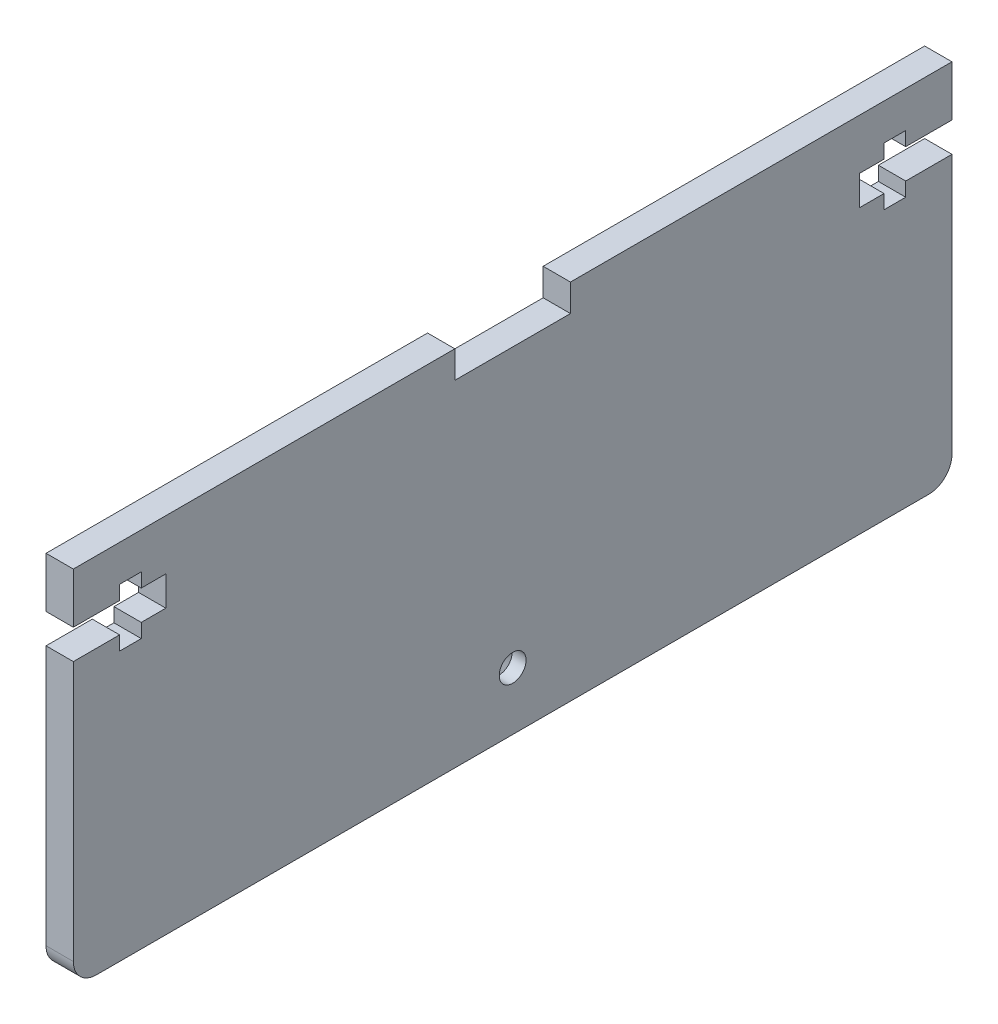
ISO-10303-21;
HEADER;
FILE_DESCRIPTION(('STEP AP214'),'2;1');
FILE_NAME('part.step','',(''),(''),'','','');
FILE_SCHEMA(('AUTOMOTIVE_DESIGN { 1 0 10303 214 1 1 1 1 }'));
ENDSEC;
DATA;
#1=APPLICATION_CONTEXT('core data for automotive mechanical design processes');
#2=APPLICATION_PROTOCOL_DEFINITION('international standard','automotive_design',2000,#1);
#3=PRODUCT_CONTEXT('',#1,'mechanical');
#4=PRODUCT('Part','Part','',(#3));
#5=PRODUCT_RELATED_PRODUCT_CATEGORY('part','',(#4));
#6=PRODUCT_DEFINITION_FORMATION('','',#4);
#7=PRODUCT_DEFINITION_CONTEXT('part definition',#1,'design');
#8=PRODUCT_DEFINITION('design','',#6,#7);
#9=PRODUCT_DEFINITION_SHAPE('','',#8);
#10=(LENGTH_UNIT() NAMED_UNIT(*) SI_UNIT(.MILLI.,.METRE.));
#11=(NAMED_UNIT(*) PLANE_ANGLE_UNIT() SI_UNIT($,.RADIAN.));
#12=(NAMED_UNIT(*) SI_UNIT($,.STERADIAN.) SOLID_ANGLE_UNIT());
#13=UNCERTAINTY_MEASURE_WITH_UNIT(LENGTH_MEASURE(1.E-05),#10,'distance_accuracy_value','');
#14=(GEOMETRIC_REPRESENTATION_CONTEXT(3) GLOBAL_UNCERTAINTY_ASSIGNED_CONTEXT((#13)) GLOBAL_UNIT_ASSIGNED_CONTEXT((#10,
#11,#12)) REPRESENTATION_CONTEXT('',''));
#15=CARTESIAN_POINT('',(0.,0.,0.));
#16=DIRECTION('',(0.,0.,1.));
#17=DIRECTION('',(1.,0.,0.));
#18=AXIS2_PLACEMENT_3D('',#15,#16,#17);
#19=CARTESIAN_POINT('',(3.,39.878,0.));
#20=DIRECTION('',(0.,-1.,0.));
#21=DIRECTION('',(0.,0.,-1.));
#22=AXIS2_PLACEMENT_3D('',#19,#20,#21);
#23=PLANE('',#22);
#24=DIRECTION('',(0.,0.,1.));
#25=VECTOR('',#24,1.);
#26=CARTESIAN_POINT('',(3.,39.878,0.));
#27=LINE('',#26,#25);
#28=CARTESIAN_POINT('',(3.,39.878,-41.91));
#29=VERTEX_POINT('',#28);
#30=CARTESIAN_POINT('',(3.,39.878,0.));
#31=VERTEX_POINT('',#30);
#32=EDGE_CURVE('E489',#29,#31,#27,.T.);
#33=ORIENTED_EDGE('',*,*,#32,.F.);
#34=DIRECTION('',(1.,0.,0.));
#35=VECTOR('',#34,1.);
#36=CARTESIAN_POINT('',(0.,39.878,-41.91));
#37=LINE('',#36,#35);
#38=CARTESIAN_POINT('',(0.,39.878,-41.91));
#39=VERTEX_POINT('',#38);
#40=EDGE_CURVE('E285',#39,#29,#37,.T.);
#41=ORIENTED_EDGE('',*,*,#40,.F.);
#42=DIRECTION('',(0.,0.,1.));
#43=VECTOR('',#42,1.);
#44=CARTESIAN_POINT('',(0.,39.878,0.));
#45=LINE('',#44,#43);
#46=CARTESIAN_POINT('',(0.,39.878,0.));
#47=VERTEX_POINT('',#46);
#48=EDGE_CURVE('E276',#39,#47,#45,.T.);
#49=ORIENTED_EDGE('',*,*,#48,.T.);
#50=DIRECTION('',(-1.,0.,0.));
#51=VECTOR('',#50,1.);
#52=CARTESIAN_POINT('',(3.,39.878,0.));
#53=LINE('',#52,#51);
#54=EDGE_CURVE('E493',#31,#47,#53,.T.);
#55=ORIENTED_EDGE('',*,*,#54,.F.);
#56=EDGE_LOOP('',(#33,#41,#49,#55));
#57=FACE_BOUND('',#56,.T.);
#58=ADVANCED_FACE('F32',(#57),#23,.F.);
#59=CARTESIAN_POINT('',(3.,0.,-96.52));
#60=DIRECTION('',(0.,0.,1.));
#61=DIRECTION('',(1.,0.,0.));
#62=AXIS2_PLACEMENT_3D('',#59,#60,#61);
#63=PLANE('',#62);
#64=DIRECTION('',(0.,1.,0.));
#65=VECTOR('',#64,1.);
#66=CARTESIAN_POINT('',(3.,0.,-96.52));
#67=LINE('',#66,#65);
#68=CARTESIAN_POINT('',(3.,2.54,-96.52));
#69=VERTEX_POINT('',#68);
#70=CARTESIAN_POINT('',(3.,31.0741,-96.52));
#71=VERTEX_POINT('',#70);
#72=EDGE_CURVE('E487',#69,#71,#67,.T.);
#73=ORIENTED_EDGE('',*,*,#72,.F.);
#74=DIRECTION('',(-1.,0.,0.));
#75=VECTOR('',#74,1.);
#76=CARTESIAN_POINT('',(3.,2.54,-96.52));
#77=LINE('',#76,#75);
#78=CARTESIAN_POINT('',(0.,2.54,-96.52));
#79=VERTEX_POINT('',#78);
#80=EDGE_CURVE('E511',#69,#79,#77,.T.);
#81=ORIENTED_EDGE('',*,*,#80,.T.);
#82=DIRECTION('',(0.,1.,0.));
#83=VECTOR('',#82,1.);
#84=CARTESIAN_POINT('',(0.,0.,-96.52));
#85=LINE('',#84,#83);
#86=CARTESIAN_POINT('',(0.,31.0741,-96.52));
#87=VERTEX_POINT('',#86);
#88=EDGE_CURVE('E501',#79,#87,#85,.T.);
#89=ORIENTED_EDGE('',*,*,#88,.T.);
#90=DIRECTION('',(1.,0.,0.));
#91=VECTOR('',#90,1.);
#92=CARTESIAN_POINT('',(0.,31.0741,-96.52));
#93=LINE('',#92,#91);
#94=EDGE_CURVE('E326',#87,#71,#93,.T.);
#95=ORIENTED_EDGE('',*,*,#94,.T.);
#96=EDGE_LOOP('',(#73,#81,#89,#95));
#97=FACE_BOUND('',#96,.T.);
#98=ADVANCED_FACE('F534',(#97),#63,.F.);
#99=CARTESIAN_POINT('',(3.,0.,0.));
#100=DIRECTION('',(0.,0.,-1.));
#101=DIRECTION('',(-1.,0.,0.));
#102=AXIS2_PLACEMENT_3D('',#99,#100,#101);
#103=PLANE('',#102);
#104=DIRECTION('',(0.,-1.,0.));
#105=VECTOR('',#104,1.);
#106=CARTESIAN_POINT('',(0.,0.,0.));
#107=LINE('',#106,#105);
#108=CARTESIAN_POINT('',(0.,34.338,0.));
#109=VERTEX_POINT('',#108);
#110=EDGE_CURVE('E494',#47,#109,#107,.T.);
#111=ORIENTED_EDGE('',*,*,#110,.T.);
#112=DIRECTION('',(1.,0.,0.));
#113=VECTOR('',#112,1.);
#114=CARTESIAN_POINT('',(0.,34.338,0.));
#115=LINE('',#114,#113);
#116=CARTESIAN_POINT('',(3.,34.338,0.));
#117=VERTEX_POINT('',#116);
#118=EDGE_CURVE('E448',#109,#117,#115,.T.);
#119=ORIENTED_EDGE('',*,*,#118,.T.);
#120=DIRECTION('',(0.,-1.,0.));
#121=VECTOR('',#120,1.);
#122=CARTESIAN_POINT('',(3.,0.,0.));
#123=LINE('',#122,#121);
#124=EDGE_CURVE('E479',#31,#117,#123,.T.);
#125=ORIENTED_EDGE('',*,*,#124,.F.);
#126=ORIENTED_EDGE('',*,*,#54,.T.);
#127=EDGE_LOOP('',(#111,#119,#125,#126));
#128=FACE_BOUND('',#127,.T.);
#129=ADVANCED_FACE('F591',(#128),#103,.F.);
#130=CARTESIAN_POINT('',(0.,31.0741,0.));
#131=VERTEX_POINT('',#130);
#132=CARTESIAN_POINT('',(0.,2.54,0.));
#133=VERTEX_POINT('',#132);
#134=EDGE_CURVE('E478',#131,#133,#107,.T.);
#135=ORIENTED_EDGE('',*,*,#134,.T.);
#136=DIRECTION('',(-1.,0.,0.));
#137=VECTOR('',#136,1.);
#138=CARTESIAN_POINT('',(3.,2.54,0.));
#139=LINE('',#138,#137);
#140=CARTESIAN_POINT('',(3.,2.54,0.));
#141=VERTEX_POINT('',#140);
#142=EDGE_CURVE('E11',#133,#141,#139,.F.);
#143=ORIENTED_EDGE('',*,*,#142,.T.);
#144=CARTESIAN_POINT('',(3.,31.0741,0.));
#145=VERTEX_POINT('',#144);
#146=EDGE_CURVE('E483',#145,#141,#123,.T.);
#147=ORIENTED_EDGE('',*,*,#146,.F.);
#148=DIRECTION('',(1.,0.,0.));
#149=VECTOR('',#148,1.);
#150=CARTESIAN_POINT('',(0.,31.0741,0.));
#151=LINE('',#150,#149);
#152=EDGE_CURVE('E417',#131,#145,#151,.T.);
#153=ORIENTED_EDGE('',*,*,#152,.F.);
#154=EDGE_LOOP('',(#135,#143,#147,#153));
#155=FACE_BOUND('',#154,.T.);
#156=ADVANCED_FACE('F546',(#155),#103,.F.);
#157=CARTESIAN_POINT('',(3.,0.,0.));
#158=DIRECTION('',(0.,1.,0.));
#159=DIRECTION('',(0.,0.,1.));
#160=AXIS2_PLACEMENT_3D('',#157,#158,#159);
#161=PLANE('',#160);
#162=DIRECTION('',(0.,0.,-1.));
#163=VECTOR('',#162,1.);
#164=CARTESIAN_POINT('',(0.,0.,0.));
#165=LINE('',#164,#163);
#166=CARTESIAN_POINT('',(0.,0.,-2.54));
#167=VERTEX_POINT('',#166);
#168=CARTESIAN_POINT('',(0.,0.,-93.98));
#169=VERTEX_POINT('',#168);
#170=EDGE_CURVE('E497',#167,#169,#165,.T.);
#171=ORIENTED_EDGE('',*,*,#170,.T.);
#172=DIRECTION('',(-1.,0.,0.));
#173=VECTOR('',#172,1.);
#174=CARTESIAN_POINT('',(3.,0.,-93.98));
#175=LINE('',#174,#173);
#176=CARTESIAN_POINT('',(3.,0.,-93.98));
#177=VERTEX_POINT('',#176);
#178=EDGE_CURVE('E521',#169,#177,#175,.F.);
#179=ORIENTED_EDGE('',*,*,#178,.T.);
#180=DIRECTION('',(0.,0.,-1.));
#181=VECTOR('',#180,1.);
#182=CARTESIAN_POINT('',(3.,0.,0.));
#183=LINE('',#182,#181);
#184=CARTESIAN_POINT('',(3.,0.,-2.54));
#185=VERTEX_POINT('',#184);
#186=EDGE_CURVE('E482',#185,#177,#183,.T.);
#187=ORIENTED_EDGE('',*,*,#186,.F.);
#188=DIRECTION('',(-1.,0.,0.));
#189=VECTOR('',#188,1.);
#190=CARTESIAN_POINT('',(3.,0.,-2.54));
#191=LINE('',#190,#189);
#192=EDGE_CURVE('E518',#185,#167,#191,.T.);
#193=ORIENTED_EDGE('',*,*,#192,.T.);
#194=EDGE_LOOP('',(#171,#179,#187,#193));
#195=FACE_BOUND('',#194,.T.);
#196=ADVANCED_FACE('F540',(#195),#161,.F.);
#197=CARTESIAN_POINT('',(3.,34.338,-96.52));
#198=VERTEX_POINT('',#197);
#199=CARTESIAN_POINT('',(3.,39.878,-96.52));
#200=VERTEX_POINT('',#199);
#201=EDGE_CURVE('E486',#198,#200,#67,.T.);
#202=ORIENTED_EDGE('',*,*,#201,.F.);
#203=DIRECTION('',(1.,0.,0.));
#204=VECTOR('',#203,1.);
#205=CARTESIAN_POINT('',(0.,34.338,-96.52));
#206=LINE('',#205,#204);
#207=CARTESIAN_POINT('',(0.,34.338,-96.52));
#208=VERTEX_POINT('',#207);
#209=EDGE_CURVE('E379',#208,#198,#206,.T.);
#210=ORIENTED_EDGE('',*,*,#209,.F.);
#211=CARTESIAN_POINT('',(0.,39.878,-96.52));
#212=VERTEX_POINT('',#211);
#213=EDGE_CURVE('E500',#208,#212,#85,.T.);
#214=ORIENTED_EDGE('',*,*,#213,.T.);
#215=DIRECTION('',(-1.,0.,0.));
#216=VECTOR('',#215,1.);
#217=CARTESIAN_POINT('',(3.,39.878,-96.52));
#218=LINE('',#217,#216);
#219=EDGE_CURVE('E508',#200,#212,#218,.T.);
#220=ORIENTED_EDGE('',*,*,#219,.F.);
#221=EDGE_LOOP('',(#202,#210,#214,#220));
#222=FACE_BOUND('',#221,.T.);
#223=ADVANCED_FACE('F607',(#222),#63,.F.);
#224=CARTESIAN_POINT('',(0.,39.878,-54.61));
#225=VERTEX_POINT('',#224);
#226=EDGE_CURVE('E503',#212,#225,#45,.T.);
#227=ORIENTED_EDGE('',*,*,#226,.T.);
#228=DIRECTION('',(1.,0.,0.));
#229=VECTOR('',#228,1.);
#230=CARTESIAN_POINT('',(0.,39.878,-54.61));
#231=LINE('',#230,#229);
#232=CARTESIAN_POINT('',(3.,39.878,-54.61));
#233=VERTEX_POINT('',#232);
#234=EDGE_CURVE('E288',#225,#233,#231,.T.);
#235=ORIENTED_EDGE('',*,*,#234,.T.);
#236=EDGE_CURVE('E490',#200,#233,#27,.T.);
#237=ORIENTED_EDGE('',*,*,#236,.F.);
#238=ORIENTED_EDGE('',*,*,#219,.T.);
#239=EDGE_LOOP('',(#227,#235,#237,#238));
#240=FACE_BOUND('',#239,.T.);
#241=ADVANCED_FACE('F600',(#240),#23,.F.);
#242=CARTESIAN_POINT('',(3.,0.,0.));
#243=DIRECTION('',(-1.,0.,0.));
#244=DIRECTION('',(0.,0.,1.));
#245=AXIS2_PLACEMENT_3D('',#242,#243,#244);
#246=PLANE('',#245);
#247=CARTESIAN_POINT('',(3.,6.35,-48.26));
#248=DIRECTION('',(1.,0.,0.));
#249=DIRECTION('',(0.,0.,-1.));
#250=AXIS2_PLACEMENT_3D('',#247,#248,#249);
#251=CIRCLE('',#250,1.47319999999999);
#252=CARTESIAN_POINT('',(3.,6.35,-49.7332));
#253=VERTEX_POINT('',#252);
#254=EDGE_CURVE('E451',#253,#253,#251,.T.);
#255=ORIENTED_EDGE('',*,*,#254,.F.);
#256=EDGE_LOOP('',(#255));
#257=FACE_BOUND('',#256,.T.);
#258=DIRECTION('',(0.,0.,-1.));
#259=VECTOR('',#258,1.);
#260=CARTESIAN_POINT('',(3.,36.878,-41.91));
#261=LINE('',#260,#259);
#262=CARTESIAN_POINT('',(3.,36.878,-41.91));
#263=VERTEX_POINT('',#262);
#264=CARTESIAN_POINT('',(3.,36.878,-54.61));
#265=VERTEX_POINT('',#264);
#266=EDGE_CURVE('E279',#263,#265,#261,.T.);
#267=ORIENTED_EDGE('',*,*,#266,.F.);
#268=DIRECTION('',(0.,-1.,0.));
#269=VECTOR('',#268,1.);
#270=CARTESIAN_POINT('',(3.,39.878,-41.91));
#271=LINE('',#270,#269);
#272=EDGE_CURVE('E262',#29,#263,#271,.T.);
#273=ORIENTED_EDGE('',*,*,#272,.F.);
#274=ORIENTED_EDGE('',*,*,#32,.T.);
#275=ORIENTED_EDGE('',*,*,#124,.T.);
#276=DIRECTION('',(0.,0.,1.));
#277=VECTOR('',#276,1.);
#278=CARTESIAN_POINT('',(3.,34.338,0.));
#279=LINE('',#278,#277);
#280=CARTESIAN_POINT('',(3.,34.338,-5.08));
#281=VERTEX_POINT('',#280);
#282=EDGE_CURVE('E387',#281,#117,#279,.T.);
#283=ORIENTED_EDGE('',*,*,#282,.F.);
#284=DIRECTION('',(0.,-1.,0.));
#285=VECTOR('',#284,1.);
#286=CARTESIAN_POINT('',(3.,34.338,-5.08));
#287=LINE('',#286,#285);
#288=CARTESIAN_POINT('',(3.,35.88105,-5.08));
#289=VERTEX_POINT('',#288);
#290=EDGE_CURVE('E444',#289,#281,#287,.T.);
#291=ORIENTED_EDGE('',*,*,#290,.F.);
#292=DIRECTION('',(0.,0.,1.));
#293=VECTOR('',#292,1.);
#294=CARTESIAN_POINT('',(3.,35.88105,-5.08));
#295=LINE('',#294,#293);
#296=CARTESIAN_POINT('',(3.,35.88105,-7.46125));
#297=VERTEX_POINT('',#296);
#298=EDGE_CURVE('E441',#297,#289,#295,.T.);
#299=ORIENTED_EDGE('',*,*,#298,.F.);
#300=DIRECTION('',(0.,1.,0.));
#301=VECTOR('',#300,1.);
#302=CARTESIAN_POINT('',(3.,35.88105,-7.46125));
#303=LINE('',#302,#301);
#304=CARTESIAN_POINT('',(3.,34.338,-7.46125));
#305=VERTEX_POINT('',#304);
#306=EDGE_CURVE('E438',#305,#297,#303,.T.);
#307=ORIENTED_EDGE('',*,*,#306,.F.);
#308=DIRECTION('',(0.,0.,1.));
#309=VECTOR('',#308,1.);
#310=CARTESIAN_POINT('',(3.,34.338,-7.46125));
#311=LINE('',#310,#309);
#312=CARTESIAN_POINT('',(3.,34.338,-10.16));
#313=VERTEX_POINT('',#312);
#314=EDGE_CURVE('E435',#313,#305,#311,.T.);
#315=ORIENTED_EDGE('',*,*,#314,.F.);
#316=DIRECTION('',(0.,1.,0.));
#317=VECTOR('',#316,1.);
#318=CARTESIAN_POINT('',(3.,34.338,-10.16));
#319=LINE('',#318,#317);
#320=CARTESIAN_POINT('',(3.,31.0741,-10.16));
#321=VERTEX_POINT('',#320);
#322=EDGE_CURVE('E432',#321,#313,#319,.T.);
#323=ORIENTED_EDGE('',*,*,#322,.F.);
#324=DIRECTION('',(0.,0.,-1.));
#325=VECTOR('',#324,1.);
#326=CARTESIAN_POINT('',(3.,31.0741,-10.16));
#327=LINE('',#326,#325);
#328=CARTESIAN_POINT('',(3.,31.0741,-7.46125));
#329=VERTEX_POINT('',#328);
#330=EDGE_CURVE('E429',#329,#321,#327,.T.);
#331=ORIENTED_EDGE('',*,*,#330,.F.);
#332=DIRECTION('',(0.,1.,0.));
#333=VECTOR('',#332,1.);
#334=CARTESIAN_POINT('',(3.,31.0741,-7.46125));
#335=LINE('',#334,#333);
#336=CARTESIAN_POINT('',(3.,29.53105,-7.46125));
#337=VERTEX_POINT('',#336);
#338=EDGE_CURVE('E426',#337,#329,#335,.T.);
#339=ORIENTED_EDGE('',*,*,#338,.F.);
#340=DIRECTION('',(0.,0.,-1.));
#341=VECTOR('',#340,1.);
#342=CARTESIAN_POINT('',(3.,29.53105,-7.46125));
#343=LINE('',#342,#341);
#344=CARTESIAN_POINT('',(3.,29.53105,-5.08));
#345=VERTEX_POINT('',#344);
#346=EDGE_CURVE('E423',#345,#337,#343,.T.);
#347=ORIENTED_EDGE('',*,*,#346,.F.);
#348=DIRECTION('',(0.,-1.,0.));
#349=VECTOR('',#348,1.);
#350=CARTESIAN_POINT('',(3.,29.53105,-5.08));
#351=LINE('',#350,#349);
#352=CARTESIAN_POINT('',(3.,31.0741,-5.08));
#353=VERTEX_POINT('',#352);
#354=EDGE_CURVE('E420',#353,#345,#351,.T.);
#355=ORIENTED_EDGE('',*,*,#354,.F.);
#356=DIRECTION('',(0.,0.,-1.));
#357=VECTOR('',#356,1.);
#358=CARTESIAN_POINT('',(3.,31.0741,-5.08));
#359=LINE('',#358,#357);
#360=EDGE_CURVE('E360',#145,#353,#359,.T.);
#361=ORIENTED_EDGE('',*,*,#360,.F.);
#362=ORIENTED_EDGE('',*,*,#146,.T.);
#363=CARTESIAN_POINT('',(3.,2.54,-2.54));
#364=DIRECTION('',(-1.,0.,0.));
#365=DIRECTION('',(0.,0.,1.));
#366=AXIS2_PLACEMENT_3D('',#363,#364,#365);
#367=CIRCLE('',#366,2.54);
#368=EDGE_CURVE('E523',#141,#185,#367,.F.);
#369=ORIENTED_EDGE('',*,*,#368,.T.);
#370=ORIENTED_EDGE('',*,*,#186,.T.);
#371=CARTESIAN_POINT('',(3.,2.54,-93.98));
#372=DIRECTION('',(-1.,0.,0.));
#373=DIRECTION('',(0.,0.,1.));
#374=AXIS2_PLACEMENT_3D('',#371,#372,#373);
#375=CIRCLE('',#374,2.54);
#376=EDGE_CURVE('E40',#177,#69,#375,.F.);
#377=ORIENTED_EDGE('',*,*,#376,.T.);
#378=ORIENTED_EDGE('',*,*,#72,.T.);
#379=DIRECTION('',(0.,0.,-1.));
#380=VECTOR('',#379,1.);
#381=CARTESIAN_POINT('',(3.,31.0741,-91.44));
#382=LINE('',#381,#380);
#383=CARTESIAN_POINT('',(3.,31.0741,-91.44));
#384=VERTEX_POINT('',#383);
#385=EDGE_CURVE('E287',#384,#71,#382,.T.);
#386=ORIENTED_EDGE('',*,*,#385,.F.);
#387=DIRECTION('',(0.,1.,0.));
#388=VECTOR('',#387,1.);
#389=CARTESIAN_POINT('',(3.,29.53105,-91.44));
#390=LINE('',#389,#388);
#391=CARTESIAN_POINT('',(3.,29.53105,-91.44));
#392=VERTEX_POINT('',#391);
#393=EDGE_CURVE('E296',#392,#384,#390,.T.);
#394=ORIENTED_EDGE('',*,*,#393,.F.);
#395=DIRECTION('',(0.,0.,-1.));
#396=VECTOR('',#395,1.);
#397=CARTESIAN_POINT('',(3.,29.53105,-89.05875));
#398=LINE('',#397,#396);
#399=CARTESIAN_POINT('',(3.,29.53105,-89.05875));
#400=VERTEX_POINT('',#399);
#401=EDGE_CURVE('E353',#400,#392,#398,.T.);
#402=ORIENTED_EDGE('',*,*,#401,.F.);
#403=DIRECTION('',(0.,-1.,0.));
#404=VECTOR('',#403,1.);
#405=CARTESIAN_POINT('',(3.,31.0741,-89.05875));
#406=LINE('',#405,#404);
#407=CARTESIAN_POINT('',(3.,31.0741,-89.05875));
#408=VERTEX_POINT('',#407);
#409=EDGE_CURVE('E350',#408,#400,#406,.T.);
#410=ORIENTED_EDGE('',*,*,#409,.F.);
#411=DIRECTION('',(0.,0.,-1.));
#412=VECTOR('',#411,1.);
#413=CARTESIAN_POINT('',(3.,31.0741,-86.36));
#414=LINE('',#413,#412);
#415=CARTESIAN_POINT('',(3.,31.0741,-86.36));
#416=VERTEX_POINT('',#415);
#417=EDGE_CURVE('E347',#416,#408,#414,.T.);
#418=ORIENTED_EDGE('',*,*,#417,.F.);
#419=DIRECTION('',(0.,-1.,0.));
#420=VECTOR('',#419,1.);
#421=CARTESIAN_POINT('',(3.,34.338,-86.36));
#422=LINE('',#421,#420);
#423=CARTESIAN_POINT('',(3.,34.338,-86.36));
#424=VERTEX_POINT('',#423);
#425=EDGE_CURVE('E344',#424,#416,#422,.T.);
#426=ORIENTED_EDGE('',*,*,#425,.F.);
#427=DIRECTION('',(0.,0.,1.));
#428=VECTOR('',#427,1.);
#429=CARTESIAN_POINT('',(3.,34.338,-89.05875));
#430=LINE('',#429,#428);
#431=CARTESIAN_POINT('',(3.,34.338,-89.05875));
#432=VERTEX_POINT('',#431);
#433=EDGE_CURVE('E341',#432,#424,#430,.T.);
#434=ORIENTED_EDGE('',*,*,#433,.F.);
#435=DIRECTION('',(0.,-1.,0.));
#436=VECTOR('',#435,1.);
#437=CARTESIAN_POINT('',(3.,35.88105,-89.05875));
#438=LINE('',#437,#436);
#439=CARTESIAN_POINT('',(3.,35.88105,-89.05875));
#440=VERTEX_POINT('',#439);
#441=EDGE_CURVE('E338',#440,#432,#438,.T.);
#442=ORIENTED_EDGE('',*,*,#441,.F.);
#443=DIRECTION('',(0.,0.,1.));
#444=VECTOR('',#443,1.);
#445=CARTESIAN_POINT('',(3.,35.88105,-91.44));
#446=LINE('',#445,#444);
#447=CARTESIAN_POINT('',(3.,35.88105,-91.44));
#448=VERTEX_POINT('',#447);
#449=EDGE_CURVE('E335',#448,#440,#446,.T.);
#450=ORIENTED_EDGE('',*,*,#449,.F.);
#451=DIRECTION('',(0.,1.,0.));
#452=VECTOR('',#451,1.);
#453=CARTESIAN_POINT('',(3.,34.338,-91.44));
#454=LINE('',#453,#452);
#455=CARTESIAN_POINT('',(3.,34.338,-91.44));
#456=VERTEX_POINT('',#455);
#457=EDGE_CURVE('E332',#456,#448,#454,.T.);
#458=ORIENTED_EDGE('',*,*,#457,.F.);
#459=DIRECTION('',(0.,0.,1.));
#460=VECTOR('',#459,1.);
#461=CARTESIAN_POINT('',(3.,34.338,-96.52));
#462=LINE('',#461,#460);
#463=EDGE_CURVE('E329',#198,#456,#462,.T.);
#464=ORIENTED_EDGE('',*,*,#463,.F.);
#465=ORIENTED_EDGE('',*,*,#201,.T.);
#466=ORIENTED_EDGE('',*,*,#236,.T.);
#467=DIRECTION('',(0.,1.,0.));
#468=VECTOR('',#467,1.);
#469=CARTESIAN_POINT('',(3.,39.878,-54.61));
#470=LINE('',#469,#468);
#471=EDGE_CURVE('E277',#265,#233,#470,.T.);
#472=ORIENTED_EDGE('',*,*,#471,.F.);
#473=EDGE_LOOP('',(#267,#273,#274,#275,#283,#291,#299,#307,#315,#323,#331,#339,#347,#355,#361,
#362,#369,#370,#377,#378,#386,#394,#402,#410,#418,#426,#434,#442,#450,#458,#464,#465,#466,#472));
#474=FACE_BOUND('',#473,.T.);
#475=ADVANCED_FACE('F527',(#257,#474),#246,.F.);
#476=CARTESIAN_POINT('',(0.,0.,0.));
#477=DIRECTION('',(-1.,0.,0.));
#478=DIRECTION('',(0.,0.,1.));
#479=AXIS2_PLACEMENT_3D('',#476,#477,#478);
#480=PLANE('',#479);
#481=DIRECTION('',(0.,-1.,0.));
#482=VECTOR('',#481,1.);
#483=CARTESIAN_POINT('',(0.,39.878,-41.91));
#484=LINE('',#483,#482);
#485=CARTESIAN_POINT('',(0.,36.878,-41.91));
#486=VERTEX_POINT('',#485);
#487=EDGE_CURVE('E259',#39,#486,#484,.T.);
#488=ORIENTED_EDGE('',*,*,#487,.T.);
#489=DIRECTION('',(0.,0.,-1.));
#490=VECTOR('',#489,1.);
#491=CARTESIAN_POINT('',(0.,36.878,-41.91));
#492=LINE('',#491,#490);
#493=CARTESIAN_POINT('',(0.,36.878,-54.61));
#494=VERTEX_POINT('',#493);
#495=EDGE_CURVE('E269',#486,#494,#492,.T.);
#496=ORIENTED_EDGE('',*,*,#495,.T.);
#497=DIRECTION('',(0.,1.,0.));
#498=VECTOR('',#497,1.);
#499=CARTESIAN_POINT('',(0.,39.878,-54.61));
#500=LINE('',#499,#498);
#501=EDGE_CURVE('E47',#494,#225,#500,.T.);
#502=ORIENTED_EDGE('',*,*,#501,.T.);
#503=ORIENTED_EDGE('',*,*,#226,.F.);
#504=ORIENTED_EDGE('',*,*,#213,.F.);
#505=DIRECTION('',(0.,0.,1.));
#506=VECTOR('',#505,1.);
#507=CARTESIAN_POINT('',(0.,34.338,-96.52));
#508=LINE('',#507,#506);
#509=CARTESIAN_POINT('',(0.,34.338,-91.44));
#510=VERTEX_POINT('',#509);
#511=EDGE_CURVE('E295',#208,#510,#508,.T.);
#512=ORIENTED_EDGE('',*,*,#511,.T.);
#513=DIRECTION('',(0.,1.,0.));
#514=VECTOR('',#513,1.);
#515=CARTESIAN_POINT('',(0.,34.338,-91.44));
#516=LINE('',#515,#514);
#517=CARTESIAN_POINT('',(0.,35.88105,-91.44));
#518=VERTEX_POINT('',#517);
#519=EDGE_CURVE('E299',#510,#518,#516,.T.);
#520=ORIENTED_EDGE('',*,*,#519,.T.);
#521=DIRECTION('',(0.,0.,1.));
#522=VECTOR('',#521,1.);
#523=CARTESIAN_POINT('',(0.,35.88105,-91.44));
#524=LINE('',#523,#522);
#525=CARTESIAN_POINT('',(0.,35.88105,-89.05875));
#526=VERTEX_POINT('',#525);
#527=EDGE_CURVE('E302',#518,#526,#524,.T.);
#528=ORIENTED_EDGE('',*,*,#527,.T.);
#529=DIRECTION('',(0.,-1.,0.));
#530=VECTOR('',#529,1.);
#531=CARTESIAN_POINT('',(0.,35.88105,-89.05875));
#532=LINE('',#531,#530);
#533=CARTESIAN_POINT('',(0.,34.338,-89.05875));
#534=VERTEX_POINT('',#533);
#535=EDGE_CURVE('E305',#526,#534,#532,.T.);
#536=ORIENTED_EDGE('',*,*,#535,.T.);
#537=DIRECTION('',(0.,0.,1.));
#538=VECTOR('',#537,1.);
#539=CARTESIAN_POINT('',(0.,34.338,-89.05875));
#540=LINE('',#539,#538);
#541=CARTESIAN_POINT('',(0.,34.338,-86.36));
#542=VERTEX_POINT('',#541);
#543=EDGE_CURVE('E308',#534,#542,#540,.T.);
#544=ORIENTED_EDGE('',*,*,#543,.T.);
#545=DIRECTION('',(0.,-1.,0.));
#546=VECTOR('',#545,1.);
#547=CARTESIAN_POINT('',(0.,34.338,-86.36));
#548=LINE('',#547,#546);
#549=CARTESIAN_POINT('',(0.,31.0741,-86.36));
#550=VERTEX_POINT('',#549);
#551=EDGE_CURVE('E311',#542,#550,#548,.T.);
#552=ORIENTED_EDGE('',*,*,#551,.T.);
#553=DIRECTION('',(0.,0.,-1.));
#554=VECTOR('',#553,1.);
#555=CARTESIAN_POINT('',(0.,31.0741,-86.36));
#556=LINE('',#555,#554);
#557=CARTESIAN_POINT('',(0.,31.0741,-89.05875));
#558=VERTEX_POINT('',#557);
#559=EDGE_CURVE('E314',#550,#558,#556,.T.);
#560=ORIENTED_EDGE('',*,*,#559,.T.);
#561=DIRECTION('',(0.,-1.,0.));
#562=VECTOR('',#561,1.);
#563=CARTESIAN_POINT('',(0.,31.0741,-89.05875));
#564=LINE('',#563,#562);
#565=CARTESIAN_POINT('',(0.,29.53105,-89.05875));
#566=VERTEX_POINT('',#565);
#567=EDGE_CURVE('E317',#558,#566,#564,.T.);
#568=ORIENTED_EDGE('',*,*,#567,.T.);
#569=DIRECTION('',(0.,0.,-1.));
#570=VECTOR('',#569,1.);
#571=CARTESIAN_POINT('',(0.,29.53105,-89.05875));
#572=LINE('',#571,#570);
#573=CARTESIAN_POINT('',(0.,29.53105,-91.44));
#574=VERTEX_POINT('',#573);
#575=EDGE_CURVE('E320',#566,#574,#572,.T.);
#576=ORIENTED_EDGE('',*,*,#575,.T.);
#577=DIRECTION('',(0.,1.,0.));
#578=VECTOR('',#577,1.);
#579=CARTESIAN_POINT('',(0.,29.53105,-91.44));
#580=LINE('',#579,#578);
#581=CARTESIAN_POINT('',(0.,31.0741,-91.44));
#582=VERTEX_POINT('',#581);
#583=EDGE_CURVE('E323',#574,#582,#580,.T.);
#584=ORIENTED_EDGE('',*,*,#583,.T.);
#585=DIRECTION('',(0.,0.,-1.));
#586=VECTOR('',#585,1.);
#587=CARTESIAN_POINT('',(0.,31.0741,-91.44));
#588=LINE('',#587,#586);
#589=EDGE_CURVE('E292',#582,#87,#588,.T.);
#590=ORIENTED_EDGE('',*,*,#589,.T.);
#591=ORIENTED_EDGE('',*,*,#88,.F.);
#592=CARTESIAN_POINT('',(0.,2.54,-93.98));
#593=DIRECTION('',(-1.,0.,0.));
#594=DIRECTION('',(0.,0.,1.));
#595=AXIS2_PLACEMENT_3D('',#592,#593,#594);
#596=CIRCLE('',#595,2.54);
#597=EDGE_CURVE('E516',#79,#169,#596,.T.);
#598=ORIENTED_EDGE('',*,*,#597,.T.);
#599=ORIENTED_EDGE('',*,*,#170,.F.);
#600=CARTESIAN_POINT('',(0.,2.54,-2.54));
#601=DIRECTION('',(-1.,0.,0.));
#602=DIRECTION('',(0.,0.,1.));
#603=AXIS2_PLACEMENT_3D('',#600,#601,#602);
#604=CIRCLE('',#603,2.54);
#605=EDGE_CURVE('E514',#167,#133,#604,.T.);
#606=ORIENTED_EDGE('',*,*,#605,.T.);
#607=ORIENTED_EDGE('',*,*,#134,.F.);
#608=DIRECTION('',(0.,0.,-1.));
#609=VECTOR('',#608,1.);
#610=CARTESIAN_POINT('',(0.,31.0741,-5.08));
#611=LINE('',#610,#609);
#612=CARTESIAN_POINT('',(0.,31.0741,-5.08));
#613=VERTEX_POINT('',#612);
#614=EDGE_CURVE('E383',#131,#613,#611,.T.);
#615=ORIENTED_EDGE('',*,*,#614,.T.);
#616=DIRECTION('',(0.,-1.,0.));
#617=VECTOR('',#616,1.);
#618=CARTESIAN_POINT('',(0.,29.53105,-5.08));
#619=LINE('',#618,#617);
#620=CARTESIAN_POINT('',(0.,29.53105,-5.08));
#621=VERTEX_POINT('',#620);
#622=EDGE_CURVE('E386',#613,#621,#619,.T.);
#623=ORIENTED_EDGE('',*,*,#622,.T.);
#624=DIRECTION('',(0.,0.,-1.));
#625=VECTOR('',#624,1.);
#626=CARTESIAN_POINT('',(0.,29.53105,-7.46125));
#627=LINE('',#626,#625);
#628=CARTESIAN_POINT('',(0.,29.53105,-7.46125));
#629=VERTEX_POINT('',#628);
#630=EDGE_CURVE('E390',#621,#629,#627,.T.);
#631=ORIENTED_EDGE('',*,*,#630,.T.);
#632=DIRECTION('',(0.,1.,0.));
#633=VECTOR('',#632,1.);
#634=CARTESIAN_POINT('',(0.,31.0741,-7.46125));
#635=LINE('',#634,#633);
#636=CARTESIAN_POINT('',(0.,31.0741,-7.46125));
#637=VERTEX_POINT('',#636);
#638=EDGE_CURVE('E393',#629,#637,#635,.T.);
#639=ORIENTED_EDGE('',*,*,#638,.T.);
#640=DIRECTION('',(0.,0.,-1.));
#641=VECTOR('',#640,1.);
#642=CARTESIAN_POINT('',(0.,31.0741,-10.16));
#643=LINE('',#642,#641);
#644=CARTESIAN_POINT('',(0.,31.0741,-10.16));
#645=VERTEX_POINT('',#644);
#646=EDGE_CURVE('E396',#637,#645,#643,.T.);
#647=ORIENTED_EDGE('',*,*,#646,.T.);
#648=DIRECTION('',(0.,1.,0.));
#649=VECTOR('',#648,1.);
#650=CARTESIAN_POINT('',(0.,34.338,-10.16));
#651=LINE('',#650,#649);
#652=CARTESIAN_POINT('',(0.,34.338,-10.16));
#653=VERTEX_POINT('',#652);
#654=EDGE_CURVE('E399',#645,#653,#651,.T.);
#655=ORIENTED_EDGE('',*,*,#654,.T.);
#656=DIRECTION('',(0.,0.,1.));
#657=VECTOR('',#656,1.);
#658=CARTESIAN_POINT('',(0.,34.338,-7.46125));
#659=LINE('',#658,#657);
#660=CARTESIAN_POINT('',(0.,34.338,-7.46125));
#661=VERTEX_POINT('',#660);
#662=EDGE_CURVE('E402',#653,#661,#659,.T.);
#663=ORIENTED_EDGE('',*,*,#662,.T.);
#664=DIRECTION('',(0.,1.,0.));
#665=VECTOR('',#664,1.);
#666=CARTESIAN_POINT('',(0.,35.88105,-7.46125));
#667=LINE('',#666,#665);
#668=CARTESIAN_POINT('',(0.,35.88105,-7.46125));
#669=VERTEX_POINT('',#668);
#670=EDGE_CURVE('E405',#661,#669,#667,.T.);
#671=ORIENTED_EDGE('',*,*,#670,.T.);
#672=DIRECTION('',(0.,0.,1.));
#673=VECTOR('',#672,1.);
#674=CARTESIAN_POINT('',(0.,35.88105,-5.08));
#675=LINE('',#674,#673);
#676=CARTESIAN_POINT('',(0.,35.88105,-5.08));
#677=VERTEX_POINT('',#676);
#678=EDGE_CURVE('E408',#669,#677,#675,.T.);
#679=ORIENTED_EDGE('',*,*,#678,.T.);
#680=DIRECTION('',(0.,-1.,0.));
#681=VECTOR('',#680,1.);
#682=CARTESIAN_POINT('',(0.,34.338,-5.08));
#683=LINE('',#682,#681);
#684=CARTESIAN_POINT('',(0.,34.338,-5.08));
#685=VERTEX_POINT('',#684);
#686=EDGE_CURVE('E411',#677,#685,#683,.T.);
#687=ORIENTED_EDGE('',*,*,#686,.T.);
#688=DIRECTION('',(0.,0.,1.));
#689=VECTOR('',#688,1.);
#690=CARTESIAN_POINT('',(0.,34.338,0.));
#691=LINE('',#690,#689);
#692=EDGE_CURVE('E414',#685,#109,#691,.T.);
#693=ORIENTED_EDGE('',*,*,#692,.T.);
#694=ORIENTED_EDGE('',*,*,#110,.F.);
#695=ORIENTED_EDGE('',*,*,#48,.F.);
#696=EDGE_LOOP('',(#488,#496,#502,#503,#504,#512,#520,#528,#536,#544,#552,#560,#568,#576,#584,
#590,#591,#598,#599,#606,#607,#615,#623,#631,#639,#647,#655,#663,#671,#679,#687,#693,#694,#695));
#697=FACE_BOUND('',#696,.T.);
#698=ADVANCED_FACE('F274',(#697),#480,.T.);
#699=CARTESIAN_POINT('',(1.476,6.35,-48.26));
#700=DIRECTION('',(1.,0.,0.));
#701=DIRECTION('',(0.,0.,-1.));
#702=AXIS2_PLACEMENT_3D('',#699,#700,#701);
#703=CONICAL_SURFACE('',#702,1.47319999999999,1.02974425867665);
#704=CARTESIAN_POINT('',(0.590812136048598,6.35,-48.26));
#705=VERTEX_POINT('',#704);
#706=VERTEX_LOOP('',#705);
#707=FACE_BOUND('',#706,.T.);
#708=CARTESIAN_POINT('',(1.476,6.35,-48.26));
#709=DIRECTION('',(1.,0.,0.));
#710=DIRECTION('',(0.,0.,-1.));
#711=AXIS2_PLACEMENT_3D('',#708,#709,#710);
#712=CIRCLE('',#711,1.47319999999999);
#713=CARTESIAN_POINT('',(1.476,6.35,-49.7332));
#714=VERTEX_POINT('',#713);
#715=EDGE_CURVE('E475',#714,#714,#712,.T.);
#716=ORIENTED_EDGE('',*,*,#715,.T.);
#717=EDGE_LOOP('',(#716));
#718=FACE_BOUND('',#717,.T.);
#719=ADVANCED_FACE('F888',(#707,#718),#703,.F.);
#720=CARTESIAN_POINT('',(3.,6.35,-48.26));
#721=DIRECTION('',(1.,0.,0.));
#722=DIRECTION('',(0.,0.,-1.));
#723=AXIS2_PLACEMENT_3D('',#720,#721,#722);
#724=CYLINDRICAL_SURFACE('',#723,1.47319999999999);
#725=ORIENTED_EDGE('',*,*,#715,.F.);
#726=EDGE_LOOP('',(#725));
#727=FACE_BOUND('',#726,.T.);
#728=ORIENTED_EDGE('',*,*,#254,.T.);
#729=EDGE_LOOP('',(#728));
#730=FACE_BOUND('',#729,.T.);
#731=ADVANCED_FACE('F870',(#727,#730),#724,.F.);
#732=CARTESIAN_POINT('',(0.,34.338,0.));
#733=DIRECTION('',(0.,1.,0.));
#734=DIRECTION('',(0.,0.,1.));
#735=AXIS2_PLACEMENT_3D('',#732,#733,#734);
#736=PLANE('',#735);
#737=ORIENTED_EDGE('',*,*,#282,.T.);
#738=ORIENTED_EDGE('',*,*,#118,.F.);
#739=ORIENTED_EDGE('',*,*,#692,.F.);
#740=DIRECTION('',(1.,0.,0.));
#741=VECTOR('',#740,1.);
#742=CARTESIAN_POINT('',(0.,34.338,-5.08));
#743=LINE('',#742,#741);
#744=EDGE_CURVE('E452',#685,#281,#743,.T.);
#745=ORIENTED_EDGE('',*,*,#744,.T.);
#746=EDGE_LOOP('',(#737,#738,#739,#745));
#747=FACE_BOUND('',#746,.T.);
#748=ADVANCED_FACE('F589',(#747),#736,.F.);
#749=CARTESIAN_POINT('',(0.,34.338,-5.08));
#750=DIRECTION('',(0.,0.,1.));
#751=DIRECTION('',(1.,0.,0.));
#752=AXIS2_PLACEMENT_3D('',#749,#750,#751);
#753=PLANE('',#752);
#754=ORIENTED_EDGE('',*,*,#290,.T.);
#755=ORIENTED_EDGE('',*,*,#744,.F.);
#756=ORIENTED_EDGE('',*,*,#686,.F.);
#757=DIRECTION('',(1.,0.,0.));
#758=VECTOR('',#757,1.);
#759=CARTESIAN_POINT('',(0.,35.88105,-5.08));
#760=LINE('',#759,#758);
#761=EDGE_CURVE('E454',#677,#289,#760,.T.);
#762=ORIENTED_EDGE('',*,*,#761,.T.);
#763=EDGE_LOOP('',(#754,#755,#756,#762));
#764=FACE_BOUND('',#763,.T.);
#765=ADVANCED_FACE('F585',(#764),#753,.F.);
#766=CARTESIAN_POINT('',(0.,35.88105,-5.08));
#767=DIRECTION('',(0.,1.,0.));
#768=DIRECTION('',(0.,0.,1.));
#769=AXIS2_PLACEMENT_3D('',#766,#767,#768);
#770=PLANE('',#769);
#771=ORIENTED_EDGE('',*,*,#298,.T.);
#772=ORIENTED_EDGE('',*,*,#761,.F.);
#773=ORIENTED_EDGE('',*,*,#678,.F.);
#774=DIRECTION('',(1.,0.,0.));
#775=VECTOR('',#774,1.);
#776=CARTESIAN_POINT('',(0.,35.88105,-7.46125));
#777=LINE('',#776,#775);
#778=EDGE_CURVE('E456',#669,#297,#777,.T.);
#779=ORIENTED_EDGE('',*,*,#778,.T.);
#780=EDGE_LOOP('',(#771,#772,#773,#779));
#781=FACE_BOUND('',#780,.T.);
#782=ADVANCED_FACE('F581',(#781),#770,.F.);
#783=CARTESIAN_POINT('',(0.,35.88105,-7.46125));
#784=DIRECTION('',(0.,0.,-1.));
#785=DIRECTION('',(-1.,0.,0.));
#786=AXIS2_PLACEMENT_3D('',#783,#784,#785);
#787=PLANE('',#786);
#788=ORIENTED_EDGE('',*,*,#306,.T.);
#789=ORIENTED_EDGE('',*,*,#778,.F.);
#790=ORIENTED_EDGE('',*,*,#670,.F.);
#791=DIRECTION('',(1.,0.,0.));
#792=VECTOR('',#791,1.);
#793=CARTESIAN_POINT('',(0.,34.338,-7.46125));
#794=LINE('',#793,#792);
#795=EDGE_CURVE('E458',#661,#305,#794,.T.);
#796=ORIENTED_EDGE('',*,*,#795,.T.);
#797=EDGE_LOOP('',(#788,#789,#790,#796));
#798=FACE_BOUND('',#797,.T.);
#799=ADVANCED_FACE('F577',(#798),#787,.F.);
#800=CARTESIAN_POINT('',(0.,34.338,-7.46125));
#801=DIRECTION('',(0.,1.,0.));
#802=DIRECTION('',(0.,0.,1.));
#803=AXIS2_PLACEMENT_3D('',#800,#801,#802);
#804=PLANE('',#803);
#805=ORIENTED_EDGE('',*,*,#314,.T.);
#806=ORIENTED_EDGE('',*,*,#795,.F.);
#807=ORIENTED_EDGE('',*,*,#662,.F.);
#808=DIRECTION('',(1.,0.,0.));
#809=VECTOR('',#808,1.);
#810=CARTESIAN_POINT('',(0.,34.338,-10.16));
#811=LINE('',#810,#809);
#812=EDGE_CURVE('E460',#653,#313,#811,.T.);
#813=ORIENTED_EDGE('',*,*,#812,.T.);
#814=EDGE_LOOP('',(#805,#806,#807,#813));
#815=FACE_BOUND('',#814,.T.);
#816=ADVANCED_FACE('F573',(#815),#804,.F.);
#817=CARTESIAN_POINT('',(0.,34.338,-10.16));
#818=DIRECTION('',(0.,0.,-1.));
#819=DIRECTION('',(-1.,0.,0.));
#820=AXIS2_PLACEMENT_3D('',#817,#818,#819);
#821=PLANE('',#820);
#822=ORIENTED_EDGE('',*,*,#322,.T.);
#823=ORIENTED_EDGE('',*,*,#812,.F.);
#824=ORIENTED_EDGE('',*,*,#654,.F.);
#825=DIRECTION('',(1.,0.,0.));
#826=VECTOR('',#825,1.);
#827=CARTESIAN_POINT('',(0.,31.0741,-10.16));
#828=LINE('',#827,#826);
#829=EDGE_CURVE('E462',#645,#321,#828,.T.);
#830=ORIENTED_EDGE('',*,*,#829,.T.);
#831=EDGE_LOOP('',(#822,#823,#824,#830));
#832=FACE_BOUND('',#831,.T.);
#833=ADVANCED_FACE('F569',(#832),#821,.F.);
#834=CARTESIAN_POINT('',(0.,31.0741,-10.16));
#835=DIRECTION('',(0.,-1.,0.));
#836=DIRECTION('',(0.,0.,-1.));
#837=AXIS2_PLACEMENT_3D('',#834,#835,#836);
#838=PLANE('',#837);
#839=ORIENTED_EDGE('',*,*,#330,.T.);
#840=ORIENTED_EDGE('',*,*,#829,.F.);
#841=ORIENTED_EDGE('',*,*,#646,.F.);
#842=DIRECTION('',(1.,0.,0.));
#843=VECTOR('',#842,1.);
#844=CARTESIAN_POINT('',(0.,31.0741,-7.46125));
#845=LINE('',#844,#843);
#846=EDGE_CURVE('E464',#637,#329,#845,.T.);
#847=ORIENTED_EDGE('',*,*,#846,.T.);
#848=EDGE_LOOP('',(#839,#840,#841,#847));
#849=FACE_BOUND('',#848,.T.);
#850=ADVANCED_FACE('F565',(#849),#838,.F.);
#851=CARTESIAN_POINT('',(0.,31.0741,-7.46125));
#852=DIRECTION('',(0.,0.,-1.));
#853=DIRECTION('',(-1.,0.,0.));
#854=AXIS2_PLACEMENT_3D('',#851,#852,#853);
#855=PLANE('',#854);
#856=ORIENTED_EDGE('',*,*,#338,.T.);
#857=ORIENTED_EDGE('',*,*,#846,.F.);
#858=ORIENTED_EDGE('',*,*,#638,.F.);
#859=DIRECTION('',(1.,0.,0.));
#860=VECTOR('',#859,1.);
#861=CARTESIAN_POINT('',(0.,29.53105,-7.46125));
#862=LINE('',#861,#860);
#863=EDGE_CURVE('E466',#629,#337,#862,.T.);
#864=ORIENTED_EDGE('',*,*,#863,.T.);
#865=EDGE_LOOP('',(#856,#857,#858,#864));
#866=FACE_BOUND('',#865,.T.);
#867=ADVANCED_FACE('F561',(#866),#855,.F.);
#868=CARTESIAN_POINT('',(0.,29.53105,-7.46125));
#869=DIRECTION('',(0.,-1.,0.));
#870=DIRECTION('',(0.,0.,-1.));
#871=AXIS2_PLACEMENT_3D('',#868,#869,#870);
#872=PLANE('',#871);
#873=ORIENTED_EDGE('',*,*,#346,.T.);
#874=ORIENTED_EDGE('',*,*,#863,.F.);
#875=ORIENTED_EDGE('',*,*,#630,.F.);
#876=DIRECTION('',(1.,0.,0.));
#877=VECTOR('',#876,1.);
#878=CARTESIAN_POINT('',(0.,29.53105,-5.08));
#879=LINE('',#878,#877);
#880=EDGE_CURVE('E468',#621,#345,#879,.T.);
#881=ORIENTED_EDGE('',*,*,#880,.T.);
#882=EDGE_LOOP('',(#873,#874,#875,#881));
#883=FACE_BOUND('',#882,.T.);
#884=ADVANCED_FACE('F559',(#883),#872,.F.);
#885=CARTESIAN_POINT('',(0.,29.53105,-5.08));
#886=DIRECTION('',(0.,0.,1.));
#887=DIRECTION('',(0.,-1.,0.));
#888=AXIS2_PLACEMENT_3D('',#885,#886,#887);
#889=PLANE('',#888);
#890=ORIENTED_EDGE('',*,*,#354,.T.);
#891=ORIENTED_EDGE('',*,*,#880,.F.);
#892=ORIENTED_EDGE('',*,*,#622,.F.);
#893=DIRECTION('',(1.,0.,0.));
#894=VECTOR('',#893,1.);
#895=CARTESIAN_POINT('',(0.,31.0741,-5.08));
#896=LINE('',#895,#894);
#897=EDGE_CURVE('E470',#613,#353,#896,.T.);
#898=ORIENTED_EDGE('',*,*,#897,.T.);
#899=EDGE_LOOP('',(#890,#891,#892,#898));
#900=FACE_BOUND('',#899,.T.);
#901=ADVANCED_FACE('F555',(#900),#889,.F.);
#902=CARTESIAN_POINT('',(0.,31.0741,-5.08));
#903=DIRECTION('',(0.,-1.,0.));
#904=DIRECTION('',(0.,0.,-1.));
#905=AXIS2_PLACEMENT_3D('',#902,#903,#904);
#906=PLANE('',#905);
#907=ORIENTED_EDGE('',*,*,#360,.T.);
#908=ORIENTED_EDGE('',*,*,#897,.F.);
#909=ORIENTED_EDGE('',*,*,#614,.F.);
#910=ORIENTED_EDGE('',*,*,#152,.T.);
#911=EDGE_LOOP('',(#907,#908,#909,#910));
#912=FACE_BOUND('',#911,.T.);
#913=ADVANCED_FACE('F549',(#912),#906,.F.);
#914=CARTESIAN_POINT('',(0.,31.0741,-91.44));
#915=DIRECTION('',(0.,-1.,0.));
#916=DIRECTION('',(0.,0.,-1.));
#917=AXIS2_PLACEMENT_3D('',#914,#915,#916);
#918=PLANE('',#917);
#919=ORIENTED_EDGE('',*,*,#385,.T.);
#920=ORIENTED_EDGE('',*,*,#94,.F.);
#921=ORIENTED_EDGE('',*,*,#589,.F.);
#922=DIRECTION('',(1.,0.,0.));
#923=VECTOR('',#922,1.);
#924=CARTESIAN_POINT('',(0.,31.0741,-91.44));
#925=LINE('',#924,#923);
#926=EDGE_CURVE('E358',#582,#384,#925,.T.);
#927=ORIENTED_EDGE('',*,*,#926,.T.);
#928=EDGE_LOOP('',(#919,#920,#921,#927));
#929=FACE_BOUND('',#928,.T.);
#930=ADVANCED_FACE('F649',(#929),#918,.F.);
#931=CARTESIAN_POINT('',(0.,29.53105,-91.44));
#932=DIRECTION('',(0.,0.,-1.));
#933=DIRECTION('',(-1.,0.,0.));
#934=AXIS2_PLACEMENT_3D('',#931,#932,#933);
#935=PLANE('',#934);
#936=ORIENTED_EDGE('',*,*,#393,.T.);
#937=ORIENTED_EDGE('',*,*,#926,.F.);
#938=ORIENTED_EDGE('',*,*,#583,.F.);
#939=DIRECTION('',(1.,0.,0.));
#940=VECTOR('',#939,1.);
#941=CARTESIAN_POINT('',(0.,29.53105,-91.44));
#942=LINE('',#941,#940);
#943=EDGE_CURVE('E361',#574,#392,#942,.T.);
#944=ORIENTED_EDGE('',*,*,#943,.T.);
#945=EDGE_LOOP('',(#936,#937,#938,#944));
#946=FACE_BOUND('',#945,.T.);
#947=ADVANCED_FACE('F646',(#946),#935,.F.);
#948=CARTESIAN_POINT('',(0.,29.53105,-89.05875));
#949=DIRECTION('',(0.,-1.,0.));
#950=DIRECTION('',(0.,0.,-1.));
#951=AXIS2_PLACEMENT_3D('',#948,#949,#950);
#952=PLANE('',#951);
#953=ORIENTED_EDGE('',*,*,#401,.T.);
#954=ORIENTED_EDGE('',*,*,#943,.F.);
#955=ORIENTED_EDGE('',*,*,#575,.F.);
#956=DIRECTION('',(1.,0.,0.));
#957=VECTOR('',#956,1.);
#958=CARTESIAN_POINT('',(0.,29.53105,-89.05875));
#959=LINE('',#958,#957);
#960=EDGE_CURVE('E363',#566,#400,#959,.T.);
#961=ORIENTED_EDGE('',*,*,#960,.T.);
#962=EDGE_LOOP('',(#953,#954,#955,#961));
#963=FACE_BOUND('',#962,.T.);
#964=ADVANCED_FACE('F642',(#963),#952,.F.);
#965=CARTESIAN_POINT('',(0.,31.0741,-89.05875));
#966=DIRECTION('',(0.,0.,1.));
#967=DIRECTION('',(1.,0.,0.));
#968=AXIS2_PLACEMENT_3D('',#965,#966,#967);
#969=PLANE('',#968);
#970=ORIENTED_EDGE('',*,*,#409,.T.);
#971=ORIENTED_EDGE('',*,*,#960,.F.);
#972=ORIENTED_EDGE('',*,*,#567,.F.);
#973=DIRECTION('',(1.,0.,0.));
#974=VECTOR('',#973,1.);
#975=CARTESIAN_POINT('',(0.,31.0741,-89.05875));
#976=LINE('',#975,#974);
#977=EDGE_CURVE('E365',#558,#408,#976,.T.);
#978=ORIENTED_EDGE('',*,*,#977,.T.);
#979=EDGE_LOOP('',(#970,#971,#972,#978));
#980=FACE_BOUND('',#979,.T.);
#981=ADVANCED_FACE('F638',(#980),#969,.F.);
#982=CARTESIAN_POINT('',(0.,31.0741,-86.36));
#983=DIRECTION('',(0.,-1.,0.));
#984=DIRECTION('',(0.,0.,-1.));
#985=AXIS2_PLACEMENT_3D('',#982,#983,#984);
#986=PLANE('',#985);
#987=ORIENTED_EDGE('',*,*,#417,.T.);
#988=ORIENTED_EDGE('',*,*,#977,.F.);
#989=ORIENTED_EDGE('',*,*,#559,.F.);
#990=DIRECTION('',(1.,0.,0.));
#991=VECTOR('',#990,1.);
#992=CARTESIAN_POINT('',(0.,31.0741,-86.36));
#993=LINE('',#992,#991);
#994=EDGE_CURVE('E367',#550,#416,#993,.T.);
#995=ORIENTED_EDGE('',*,*,#994,.T.);
#996=EDGE_LOOP('',(#987,#988,#989,#995));
#997=FACE_BOUND('',#996,.T.);
#998=ADVANCED_FACE('F634',(#997),#986,.F.);
#999=CARTESIAN_POINT('',(0.,34.338,-86.36));
#1000=DIRECTION('',(0.,0.,1.));
#1001=DIRECTION('',(1.,0.,0.));
#1002=AXIS2_PLACEMENT_3D('',#999,#1000,#1001);
#1003=PLANE('',#1002);
#1004=ORIENTED_EDGE('',*,*,#425,.T.);
#1005=ORIENTED_EDGE('',*,*,#994,.F.);
#1006=ORIENTED_EDGE('',*,*,#551,.F.);
#1007=DIRECTION('',(1.,0.,0.));
#1008=VECTOR('',#1007,1.);
#1009=CARTESIAN_POINT('',(0.,34.338,-86.36));
#1010=LINE('',#1009,#1008);
#1011=EDGE_CURVE('E369',#542,#424,#1010,.T.);
#1012=ORIENTED_EDGE('',*,*,#1011,.T.);
#1013=EDGE_LOOP('',(#1004,#1005,#1006,#1012));
#1014=FACE_BOUND('',#1013,.T.);
#1015=ADVANCED_FACE('F630',(#1014),#1003,.F.);
#1016=CARTESIAN_POINT('',(0.,34.338,-89.05875));
#1017=DIRECTION('',(0.,1.,0.));
#1018=DIRECTION('',(0.,0.,1.));
#1019=AXIS2_PLACEMENT_3D('',#1016,#1017,#1018);
#1020=PLANE('',#1019);
#1021=ORIENTED_EDGE('',*,*,#433,.T.);
#1022=ORIENTED_EDGE('',*,*,#1011,.F.);
#1023=ORIENTED_EDGE('',*,*,#543,.F.);
#1024=DIRECTION('',(1.,0.,0.));
#1025=VECTOR('',#1024,1.);
#1026=CARTESIAN_POINT('',(0.,34.338,-89.05875));
#1027=LINE('',#1026,#1025);
#1028=EDGE_CURVE('E371',#534,#432,#1027,.T.);
#1029=ORIENTED_EDGE('',*,*,#1028,.T.);
#1030=EDGE_LOOP('',(#1021,#1022,#1023,#1029));
#1031=FACE_BOUND('',#1030,.T.);
#1032=ADVANCED_FACE('F626',(#1031),#1020,.F.);
#1033=CARTESIAN_POINT('',(0.,35.88105,-89.05875));
#1034=DIRECTION('',(0.,0.,1.));
#1035=DIRECTION('',(1.,0.,0.));
#1036=AXIS2_PLACEMENT_3D('',#1033,#1034,#1035);
#1037=PLANE('',#1036);
#1038=ORIENTED_EDGE('',*,*,#441,.T.);
#1039=ORIENTED_EDGE('',*,*,#1028,.F.);
#1040=ORIENTED_EDGE('',*,*,#535,.F.);
#1041=DIRECTION('',(1.,0.,0.));
#1042=VECTOR('',#1041,1.);
#1043=CARTESIAN_POINT('',(0.,35.88105,-89.05875));
#1044=LINE('',#1043,#1042);
#1045=EDGE_CURVE('E373',#526,#440,#1044,.T.);
#1046=ORIENTED_EDGE('',*,*,#1045,.T.);
#1047=EDGE_LOOP('',(#1038,#1039,#1040,#1046));
#1048=FACE_BOUND('',#1047,.T.);
#1049=ADVANCED_FACE('F622',(#1048),#1037,.F.);
#1050=CARTESIAN_POINT('',(0.,35.88105,-91.44));
#1051=DIRECTION('',(0.,1.,0.));
#1052=DIRECTION('',(0.,0.,1.));
#1053=AXIS2_PLACEMENT_3D('',#1050,#1051,#1052);
#1054=PLANE('',#1053);
#1055=ORIENTED_EDGE('',*,*,#449,.T.);
#1056=ORIENTED_EDGE('',*,*,#1045,.F.);
#1057=ORIENTED_EDGE('',*,*,#527,.F.);
#1058=DIRECTION('',(1.,0.,0.));
#1059=VECTOR('',#1058,1.);
#1060=CARTESIAN_POINT('',(0.,35.88105,-91.44));
#1061=LINE('',#1060,#1059);
#1062=EDGE_CURVE('E375',#518,#448,#1061,.T.);
#1063=ORIENTED_EDGE('',*,*,#1062,.T.);
#1064=EDGE_LOOP('',(#1055,#1056,#1057,#1063));
#1065=FACE_BOUND('',#1064,.T.);
#1066=ADVANCED_FACE('F620',(#1065),#1054,.F.);
#1067=CARTESIAN_POINT('',(0.,34.338,-91.44));
#1068=DIRECTION('',(0.,0.,-1.));
#1069=DIRECTION('',(-1.,0.,0.));
#1070=AXIS2_PLACEMENT_3D('',#1067,#1068,#1069);
#1071=PLANE('',#1070);
#1072=ORIENTED_EDGE('',*,*,#457,.T.);
#1073=ORIENTED_EDGE('',*,*,#1062,.F.);
#1074=ORIENTED_EDGE('',*,*,#519,.F.);
#1075=DIRECTION('',(1.,0.,0.));
#1076=VECTOR('',#1075,1.);
#1077=CARTESIAN_POINT('',(0.,34.338,-91.44));
#1078=LINE('',#1077,#1076);
#1079=EDGE_CURVE('E377',#510,#456,#1078,.T.);
#1080=ORIENTED_EDGE('',*,*,#1079,.T.);
#1081=EDGE_LOOP('',(#1072,#1073,#1074,#1080));
#1082=FACE_BOUND('',#1081,.T.);
#1083=ADVANCED_FACE('F616',(#1082),#1071,.F.);
#1084=CARTESIAN_POINT('',(0.,34.338,-96.52));
#1085=DIRECTION('',(0.,1.,0.));
#1086=DIRECTION('',(0.,0.,1.));
#1087=AXIS2_PLACEMENT_3D('',#1084,#1085,#1086);
#1088=PLANE('',#1087);
#1089=ORIENTED_EDGE('',*,*,#463,.T.);
#1090=ORIENTED_EDGE('',*,*,#1079,.F.);
#1091=ORIENTED_EDGE('',*,*,#511,.F.);
#1092=ORIENTED_EDGE('',*,*,#209,.T.);
#1093=EDGE_LOOP('',(#1089,#1090,#1091,#1092));
#1094=FACE_BOUND('',#1093,.T.);
#1095=ADVANCED_FACE('F610',(#1094),#1088,.F.);
#1096=CARTESIAN_POINT('',(3.,2.54,-93.98));
#1097=DIRECTION('',(-1.,0.,0.));
#1098=DIRECTION('',(0.,0.,1.));
#1099=AXIS2_PLACEMENT_3D('',#1096,#1097,#1098);
#1100=CYLINDRICAL_SURFACE('',#1099,2.54);
#1101=ORIENTED_EDGE('',*,*,#376,.F.);
#1102=ORIENTED_EDGE('',*,*,#178,.F.);
#1103=ORIENTED_EDGE('',*,*,#597,.F.);
#1104=ORIENTED_EDGE('',*,*,#80,.F.);
#1105=EDGE_LOOP('',(#1101,#1102,#1103,#1104));
#1106=FACE_BOUND('',#1105,.T.);
#1107=ADVANCED_FACE('F537',(#1106),#1100,.T.);
#1108=CARTESIAN_POINT('',(3.,2.54,-2.54));
#1109=DIRECTION('',(-1.,0.,0.));
#1110=DIRECTION('',(0.,0.,1.));
#1111=AXIS2_PLACEMENT_3D('',#1108,#1109,#1110);
#1112=CYLINDRICAL_SURFACE('',#1111,2.54);
#1113=ORIENTED_EDGE('',*,*,#368,.F.);
#1114=ORIENTED_EDGE('',*,*,#142,.F.);
#1115=ORIENTED_EDGE('',*,*,#605,.F.);
#1116=ORIENTED_EDGE('',*,*,#192,.F.);
#1117=EDGE_LOOP('',(#1113,#1114,#1115,#1116));
#1118=FACE_BOUND('',#1117,.T.);
#1119=ADVANCED_FACE('F34',(#1118),#1112,.T.);
#1120=CARTESIAN_POINT('',(0.,39.878,-41.91));
#1121=DIRECTION('',(0.,0.,1.));
#1122=DIRECTION('',(1.,0.,0.));
#1123=AXIS2_PLACEMENT_3D('',#1120,#1121,#1122);
#1124=PLANE('',#1123);
#1125=ORIENTED_EDGE('',*,*,#272,.T.);
#1126=DIRECTION('',(1.,0.,0.));
#1127=VECTOR('',#1126,1.);
#1128=CARTESIAN_POINT('',(0.,36.878,-41.91));
#1129=LINE('',#1128,#1127);
#1130=EDGE_CURVE('E255',#486,#263,#1129,.T.);
#1131=ORIENTED_EDGE('',*,*,#1130,.F.);
#1132=ORIENTED_EDGE('',*,*,#487,.F.);
#1133=ORIENTED_EDGE('',*,*,#40,.T.);
#1134=EDGE_LOOP('',(#1125,#1131,#1132,#1133));
#1135=FACE_BOUND('',#1134,.T.);
#1136=ADVANCED_FACE('F257',(#1135),#1124,.F.);
#1137=CARTESIAN_POINT('',(0.,39.878,-54.61));
#1138=DIRECTION('',(0.,0.,-1.));
#1139=DIRECTION('',(-1.,0.,0.));
#1140=AXIS2_PLACEMENT_3D('',#1137,#1138,#1139);
#1141=PLANE('',#1140);
#1142=ORIENTED_EDGE('',*,*,#471,.T.);
#1143=ORIENTED_EDGE('',*,*,#234,.F.);
#1144=ORIENTED_EDGE('',*,*,#501,.F.);
#1145=DIRECTION('',(1.,0.,0.));
#1146=VECTOR('',#1145,1.);
#1147=CARTESIAN_POINT('',(0.,36.878,-54.61));
#1148=LINE('',#1147,#1146);
#1149=EDGE_CURVE('E266',#494,#265,#1148,.T.);
#1150=ORIENTED_EDGE('',*,*,#1149,.T.);
#1151=EDGE_LOOP('',(#1142,#1143,#1144,#1150));
#1152=FACE_BOUND('',#1151,.T.);
#1153=ADVANCED_FACE('F598',(#1152),#1141,.F.);
#1154=CARTESIAN_POINT('',(0.,36.878,-41.91));
#1155=DIRECTION('',(0.,-1.,0.));
#1156=DIRECTION('',(0.,0.,-1.));
#1157=AXIS2_PLACEMENT_3D('',#1154,#1155,#1156);
#1158=PLANE('',#1157);
#1159=ORIENTED_EDGE('',*,*,#266,.T.);
#1160=ORIENTED_EDGE('',*,*,#1149,.F.);
#1161=ORIENTED_EDGE('',*,*,#495,.F.);
#1162=ORIENTED_EDGE('',*,*,#1130,.T.);
#1163=EDGE_LOOP('',(#1159,#1160,#1161,#1162));
#1164=FACE_BOUND('',#1163,.T.);
#1165=ADVANCED_FACE('F270',(#1164),#1158,.F.);
#1166=CLOSED_SHELL('',(#58,#98,#129,#156,#196,#223,#241,#475,#698,#719,#731,#748,#765,#782,#799,
#816,#833,#850,#867,#884,#901,#913,#930,#947,#964,#981,#998,#1015,#1032,#1049,#1066,#1083,#1095,
#1107,#1119,#1136,#1153,#1165));
#1167=MANIFOLD_SOLID_BREP('B2',#1166);
#1168=ADVANCED_BREP_SHAPE_REPRESENTATION('',(#18,#1167),#14);
#1169=SHAPE_DEFINITION_REPRESENTATION(#9,#1168);
ENDSEC;
END-ISO-10303-21;
